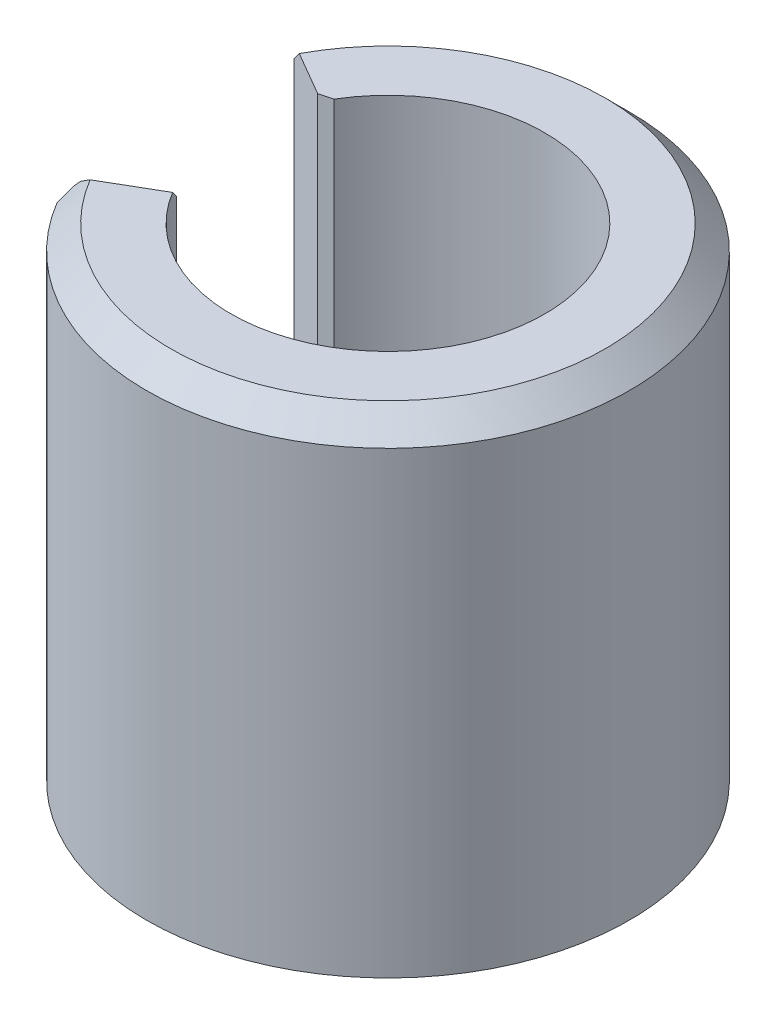
ISO-10303-21;
HEADER;
FILE_DESCRIPTION(('STEP AP214'),'2;1');
FILE_NAME('part.step','',(''),(''),'','','');
FILE_SCHEMA(('AUTOMOTIVE_DESIGN { 1 0 10303 214 1 1 1 1 }'));
ENDSEC;
DATA;
#1=APPLICATION_CONTEXT('core data for automotive mechanical design processes');
#2=APPLICATION_PROTOCOL_DEFINITION('international standard','automotive_design',2000,#1);
#3=PRODUCT_CONTEXT('',#1,'mechanical');
#4=PRODUCT('Part','Part','',(#3));
#5=PRODUCT_RELATED_PRODUCT_CATEGORY('part','',(#4));
#6=PRODUCT_DEFINITION_FORMATION('','',#4);
#7=PRODUCT_DEFINITION_CONTEXT('part definition',#1,'design');
#8=PRODUCT_DEFINITION('design','',#6,#7);
#9=PRODUCT_DEFINITION_SHAPE('','',#8);
#10=(LENGTH_UNIT() NAMED_UNIT(*) SI_UNIT(.MILLI.,.METRE.));
#11=(NAMED_UNIT(*) PLANE_ANGLE_UNIT() SI_UNIT($,.RADIAN.));
#12=(NAMED_UNIT(*) SI_UNIT($,.STERADIAN.) SOLID_ANGLE_UNIT());
#13=UNCERTAINTY_MEASURE_WITH_UNIT(LENGTH_MEASURE(1.E-05),#10,'distance_accuracy_value','');
#14=(GEOMETRIC_REPRESENTATION_CONTEXT(3) GLOBAL_UNCERTAINTY_ASSIGNED_CONTEXT((#13)) GLOBAL_UNIT_ASSIGNED_CONTEXT((#10,
#11,#12)) REPRESENTATION_CONTEXT('',''));
#15=CARTESIAN_POINT('',(0.,0.,0.));
#16=DIRECTION('',(0.,0.,1.));
#17=DIRECTION('',(1.,0.,0.));
#18=AXIS2_PLACEMENT_3D('',#15,#16,#17);
#19=CARTESIAN_POINT('',(0.,10.,0.));
#20=DIRECTION('',(0.,-1.,0.));
#21=DIRECTION('',(0.,0.,-1.));
#22=AXIS2_PLACEMENT_3D('',#19,#20,#21);
#23=CYLINDRICAL_SURFACE('',#22,3.25);
#24=DIRECTION('',(0.,-1.,0.));
#25=VECTOR('',#24,1.);
#26=CARTESIAN_POINT('',(-2.8831406486677,10.,1.5));
#27=LINE('',#26,#25);
#28=CARTESIAN_POINT('',(-2.8831406486677,9.8,1.5));
#29=VERTEX_POINT('',#28);
#30=CARTESIAN_POINT('',(-2.8831406486677,0.,1.5));
#31=VERTEX_POINT('',#30);
#32=EDGE_CURVE('E120',#29,#31,#27,.T.);
#33=ORIENTED_EDGE('',*,*,#32,.F.);
#34=CARTESIAN_POINT('',(0.,9.95138321985831,0.));
#35=DIRECTION('',(0.355221508707248,-0.707106781186546,0.611406313143517));
#36=DIRECTION('',(-0.355221508707247,-0.707106781186549,-0.611406313143515));
#37=AXIS2_PLACEMENT_3D('',#34,#35,#36);
#38=ELLIPSE('',#37,4.59619407771257,3.25);
#39=CARTESIAN_POINT('',(-2.78540456174295,10.,1.67452125320091));
#40=VERTEX_POINT('',#39);
#41=EDGE_CURVE('E157',#29,#40,#38,.F.);
#42=ORIENTED_EDGE('',*,*,#41,.T.);
#43=CARTESIAN_POINT('',(0.,10.,0.));
#44=DIRECTION('',(0.,1.,0.));
#45=DIRECTION('',(0.,0.,1.));
#46=AXIS2_PLACEMENT_3D('',#43,#44,#45);
#47=CIRCLE('',#46,3.25);
#48=CARTESIAN_POINT('',(-2.7870574838442,10.,-1.67176869863867));
#49=VERTEX_POINT('',#48);
#50=EDGE_CURVE('E152',#40,#49,#47,.T.);
#51=ORIENTED_EDGE('',*,*,#50,.T.);
#52=DIRECTION('',(0.,-1.,0.));
#53=VECTOR('',#52,1.);
#54=CARTESIAN_POINT('',(-2.7870574838442,10.,-1.67176869863867));
#55=LINE('',#54,#53);
#56=CARTESIAN_POINT('',(-2.7870574838442,0.,-1.67176869863867));
#57=VERTEX_POINT('',#56);
#58=EDGE_CURVE('E143',#49,#57,#55,.T.);
#59=ORIENTED_EDGE('',*,*,#58,.T.);
#60=CARTESIAN_POINT('',(0.,0.,0.));
#61=DIRECTION('',(0.,1.,0.));
#62=DIRECTION('',(0.,0.,1.));
#63=AXIS2_PLACEMENT_3D('',#60,#61,#62);
#64=CIRCLE('',#63,3.25);
#65=EDGE_CURVE('E135',#31,#57,#64,.T.);
#66=ORIENTED_EDGE('',*,*,#65,.F.);
#67=EDGE_LOOP('',(#33,#42,#51,#59,#66));
#68=FACE_BOUND('',#67,.T.);
#69=ADVANCED_FACE('F43',(#68),#23,.F.);
#70=CARTESIAN_POINT('',(-0.076048734337961,10.,-0.130894878663227));
#71=DIRECTION('',(-0.502359075260422,0.,-0.864659100168091));
#72=DIRECTION('',(-0.864659100168091,0.,0.502359075260422));
#73=AXIS2_PLACEMENT_3D('',#70,#71,#72);
#74=PLANE('',#73);
#75=DIRECTION('',(0.,1.,0.));
#76=VECTOR('',#75,1.);
#77=CARTESIAN_POINT('',(-4.22443043201248,10.,2.27927716840816));
#78=LINE('',#77,#76);
#79=CARTESIAN_POINT('',(-4.22443043201248,0.,2.27927716840816));
#80=VERTEX_POINT('',#79);
#81=CARTESIAN_POINT('',(-4.22443043201248,9.69990449206061,2.27927716840816));
#82=VERTEX_POINT('',#81);
#83=EDGE_CURVE('E128',#80,#82,#78,.T.);
#84=ORIENTED_EDGE('',*,*,#83,.T.);
#85=CARTESIAN_POINT('',(-4.22443043201248,9.69990449206061,2.27927716840816));
#86=CARTESIAN_POINT('',(-4.20999842873636,9.71658716612793,2.27089230572813));
#87=CARTESIAN_POINT('',(-4.19556638682498,9.73326979548987,2.26250742060136));
#88=CARTESIAN_POINT('',(-4.16670222573165,9.76663496480301,2.24573760545434));
#89=CARTESIAN_POINT('',(-4.15227010654972,9.78331750475419,2.23735267543409));
#90=CARTESIAN_POINT('',(-4.13783794873251,9.8,2.22896772296709));
#91=B_SPLINE_CURVE_WITH_KNOTS('',3,(#85,#86,#87,#88,#89,#90),.UNSPECIFIED.,.F.,.F.,(4,2,4),(0.,
0.0707962025305121,0.141592405061035),.UNSPECIFIED.);
#92=CARTESIAN_POINT('',(-4.13783794873251,9.8,2.22896772296709));
#93=VERTEX_POINT('',#92);
#94=EDGE_CURVE('E58',#82,#93,#91,.T.);
#95=ORIENTED_EDGE('',*,*,#94,.T.);
#96=DIRECTION('',(0.864659100168091,0.,-0.502359075260422));
#97=VECTOR('',#96,1.);
#98=CARTESIAN_POINT('',(-0.076048734337961,9.8,-0.130894878663227));
#99=LINE('',#98,#97);
#100=EDGE_CURVE('E124',#93,#29,#99,.T.);
#101=ORIENTED_EDGE('',*,*,#100,.T.);
#102=ORIENTED_EDGE('',*,*,#32,.T.);
#103=DIRECTION('',(0.864659100168091,0.,-0.502359075260422));
#104=VECTOR('',#103,1.);
#105=CARTESIAN_POINT('',(-0.076048734337961,0.,-0.130894878663227));
#106=LINE('',#105,#104);
#107=EDGE_CURVE('E123',#80,#31,#106,.T.);
#108=ORIENTED_EDGE('',*,*,#107,.F.);
#109=EDGE_LOOP('',(#84,#95,#101,#102,#108));
#110=FACE_BOUND('',#109,.T.);
#111=ADVANCED_FACE('F122',(#110),#74,.T.);
#112=CARTESIAN_POINT('',(0.,10.,0.));
#113=DIRECTION('',(0.,-1.,0.));
#114=DIRECTION('',(0.,0.,-1.));
#115=AXIS2_PLACEMENT_3D('',#112,#113,#114);
#116=CYLINDRICAL_SURFACE('',#115,5.);
#117=DIRECTION('',(0.,-1.,0.));
#118=VECTOR('',#117,1.);
#119=CARTESIAN_POINT('',(-4.30061913286326,10.,-2.55042644944927));
#120=LINE('',#119,#118);
#121=CARTESIAN_POINT('',(-4.30061913286326,0.,-2.55042644944927));
#122=VERTEX_POINT('',#121);
#123=CARTESIAN_POINT('',(-4.30061913286326,9.5,-2.55042644944927));
#124=VERTEX_POINT('',#123);
#125=EDGE_CURVE('E164',#122,#124,#120,.F.);
#126=ORIENTED_EDGE('',*,*,#125,.T.);
#127=CARTESIAN_POINT('',(0.,9.5,0.));
#128=DIRECTION('',(0.,1.,0.));
#129=DIRECTION('',(0.,0.,1.));
#130=AXIS2_PLACEMENT_3D('',#127,#128,#129);
#131=CIRCLE('',#130,5.);
#132=CARTESIAN_POINT('',(-4.29762794941674,9.5,2.55546356037257));
#133=VERTEX_POINT('',#132);
#134=EDGE_CURVE('E221',#124,#133,#131,.F.);
#135=ORIENTED_EDGE('',*,*,#134,.T.);
#136=DIRECTION('',(0.,-1.,0.));
#137=VECTOR('',#136,1.);
#138=CARTESIAN_POINT('',(-4.29762794941674,10.,2.55546356037257));
#139=LINE('',#138,#137);
#140=CARTESIAN_POINT('',(-4.29762794941674,0.,2.55546356037257));
#141=VERTEX_POINT('',#140);
#142=EDGE_CURVE('E167',#133,#141,#139,.T.);
#143=ORIENTED_EDGE('',*,*,#142,.T.);
#144=CARTESIAN_POINT('',(0.,0.,0.));
#145=DIRECTION('',(0.,1.,0.));
#146=DIRECTION('',(0.,0.,1.));
#147=AXIS2_PLACEMENT_3D('',#144,#145,#146);
#148=CIRCLE('',#147,5.);
#149=EDGE_CURVE('E138',#141,#122,#148,.T.);
#150=ORIENTED_EDGE('',*,*,#149,.T.);
#151=EDGE_LOOP('',(#126,#135,#143,#150));
#152=FACE_BOUND('',#151,.T.);
#153=ADVANCED_FACE('F202',(#152),#116,.T.);
#154=CARTESIAN_POINT('',(-0.0760487343379624,10.,0.130894878663229));
#155=DIRECTION('',(0.502359075260422,0.,-0.864659100168091));
#156=DIRECTION('',(-0.864659100168091,0.,-0.502359075260422));
#157=AXIS2_PLACEMENT_3D('',#154,#155,#156);
#158=PLANE('',#157);
#159=DIRECTION('',(0.864659100168091,0.,0.502359075260422));
#160=VECTOR('',#159,1.);
#161=CARTESIAN_POINT('',(-0.0760487343379624,10.,0.130894878663229));
#162=LINE('',#161,#160);
#163=CARTESIAN_POINT('',(-3.96481236313895,10.,-2.12844143097725));
#164=VERTEX_POINT('',#163);
#165=CARTESIAN_POINT('',(-3.05607246870132,10.,-1.60047181505208));
#166=VERTEX_POINT('',#165);
#167=EDGE_CURVE('E129',#164,#166,#162,.T.);
#168=ORIENTED_EDGE('',*,*,#167,.F.);
#169=CARTESIAN_POINT('',(-3.96481236313896,10.,-2.12844143097725));
#170=CARTESIAN_POINT('',(-4.00716881715182,9.95104136839675,-2.15305014563147));
#171=CARTESIAN_POINT('',(-4.04952491541295,9.90208232513896,-2.17765865359717));
#172=CARTESIAN_POINT('',(-4.13423640043159,9.80416341531452,-2.22687525615144));
#173=CARTESIAN_POINT('',(-4.17659178718909,9.75520354874788,-2.25148335074));
#174=CARTESIAN_POINT('',(-4.21894681819487,9.7062432705267,-2.27609123864004));
#175=B_SPLINE_CURVE_WITH_KNOTS('',3,(#169,#170,#171,#172,#173,#174),.UNSPECIFIED.,.F.,.F.,(4,2,
4),(0.,0.207772593881652,0.415545187762375),.UNSPECIFIED.);
#176=CARTESIAN_POINT('',(-4.21894681819487,9.7062432705267,-2.27609123864004));
#177=VERTEX_POINT('',#176);
#178=EDGE_CURVE('E182',#164,#177,#175,.T.);
#179=ORIENTED_EDGE('',*,*,#178,.T.);
#180=DIRECTION('',(0.,-1.,0.));
#181=VECTOR('',#180,1.);
#182=CARTESIAN_POINT('',(-4.21894681819487,10.,-2.27609123864004));
#183=LINE('',#182,#181);
#184=CARTESIAN_POINT('',(-4.21894681819487,0.,-2.27609123864004));
#185=VERTEX_POINT('',#184);
#186=EDGE_CURVE('E177',#177,#185,#183,.T.);
#187=ORIENTED_EDGE('',*,*,#186,.T.);
#188=DIRECTION('',(0.864659100168091,0.,0.502359075260422));
#189=VECTOR('',#188,1.);
#190=CARTESIAN_POINT('',(-0.0760487343379624,0.,0.130894878663229));
#191=LINE('',#190,#189);
#192=CARTESIAN_POINT('',(-3.05607246870132,0.,-1.60047181505208));
#193=VERTEX_POINT('',#192);
#194=EDGE_CURVE('E150',#185,#193,#191,.T.);
#195=ORIENTED_EDGE('',*,*,#194,.T.);
#196=DIRECTION('',(0.,1.,0.));
#197=VECTOR('',#196,1.);
#198=CARTESIAN_POINT('',(-3.05607246870132,10.,-1.60047181505208));
#199=LINE('',#198,#197);
#200=EDGE_CURVE('E174',#193,#166,#199,.T.);
#201=ORIENTED_EDGE('',*,*,#200,.T.);
#202=EDGE_LOOP('',(#168,#179,#187,#195,#201));
#203=FACE_BOUND('',#202,.T.);
#204=ADVANCED_FACE('F196',(#203),#158,.F.);
#205=CARTESIAN_POINT('',(0.,10.,0.));
#206=DIRECTION('',(0.,1.,0.));
#207=DIRECTION('',(0.,0.,1.));
#208=AXIS2_PLACEMENT_3D('',#205,#206,#207);
#209=PLANE('',#208);
#210=DIRECTION('',(-0.864659100168091,0.,0.502359075260422));
#211=VECTOR('',#210,1.);
#212=CARTESIAN_POINT('',(0.0244230807141206,10.,0.042036941370387));
#213=LINE('',#212,#211);
#214=CARTESIAN_POINT('',(-3.86631578555614,10.,2.3025208460206));
#215=VERTEX_POINT('',#214);
#216=EDGE_CURVE('E161',#40,#215,#213,.T.);
#217=ORIENTED_EDGE('',*,*,#216,.T.);
#218=CARTESIAN_POINT('',(0.,10.,0.));
#219=DIRECTION('',(0.,1.,0.));
#220=DIRECTION('',(0.,0.,1.));
#221=AXIS2_PLACEMENT_3D('',#218,#219,#220);
#222=CIRCLE('',#221,4.5);
#223=EDGE_CURVE('E179',#215,#164,#222,.T.);
#224=ORIENTED_EDGE('',*,*,#223,.T.);
#225=ORIENTED_EDGE('',*,*,#167,.T.);
#226=DIRECTION('',(-0.966627821850763,0.,0.256184804436268));
#227=VECTOR('',#226,1.);
#228=CARTESIAN_POINT('',(-0.59690544816139,10.,-2.25222340753874));
#229=LINE('',#228,#227);
#230=EDGE_CURVE('E159',#166,#49,#229,.F.);
#231=ORIENTED_EDGE('',*,*,#230,.T.);
#232=ORIENTED_EDGE('',*,*,#50,.F.);
#233=EDGE_LOOP('',(#217,#224,#225,#231,#232));
#234=FACE_BOUND('',#233,.T.);
#235=ADVANCED_FACE('F201',(#234),#209,.T.);
#236=CARTESIAN_POINT('',(0.,0.,0.));
#237=DIRECTION('',(0.,1.,0.));
#238=DIRECTION('',(0.,0.,1.));
#239=AXIS2_PLACEMENT_3D('',#236,#237,#238);
#240=PLANE('',#239);
#241=ORIENTED_EDGE('',*,*,#149,.F.);
#242=DIRECTION('',(-0.256184804436272,0.,0.966627821850762));
#243=VECTOR('',#242,1.);
#244=CARTESIAN_POINT('',(-4.29762794941674,0.,2.55546356037257));
#245=LINE('',#244,#243);
#246=EDGE_CURVE('E137',#141,#80,#245,.F.);
#247=ORIENTED_EDGE('',*,*,#246,.T.);
#248=ORIENTED_EDGE('',*,*,#107,.T.);
#249=ORIENTED_EDGE('',*,*,#65,.T.);
#250=DIRECTION('',(0.966627821850763,0.,-0.256184804436268));
#251=VECTOR('',#250,1.);
#252=CARTESIAN_POINT('',(-2.7870574838442,0.,-1.67176869863867));
#253=LINE('',#252,#251);
#254=EDGE_CURVE('E169',#57,#193,#253,.F.);
#255=ORIENTED_EDGE('',*,*,#254,.T.);
#256=ORIENTED_EDGE('',*,*,#194,.F.);
#257=DIRECTION('',(0.2853336048058,0.,0.958428262296416));
#258=VECTOR('',#257,1.);
#259=CARTESIAN_POINT('',(-4.21894681819487,0.,-2.27609123864004));
#260=LINE('',#259,#258);
#261=EDGE_CURVE('E171',#185,#122,#260,.F.);
#262=ORIENTED_EDGE('',*,*,#261,.T.);
#263=EDGE_LOOP('',(#241,#247,#248,#249,#255,#256,#262));
#264=FACE_BOUND('',#263,.T.);
#265=ADVANCED_FACE('F134',(#264),#240,.F.);
#266=CARTESIAN_POINT('',(-4.29762794941674,10.,2.55546356037257));
#267=DIRECTION('',(0.966627821850762,0.,0.256184804436272));
#268=DIRECTION('',(0.,-1.,0.));
#269=AXIS2_PLACEMENT_3D('',#266,#267,#268);
#270=PLANE('',#269);
#271=ORIENTED_EDGE('',*,*,#142,.F.);
#272=CARTESIAN_POINT('',(-4.29762794941674,9.5,2.55546356037257));
#273=CARTESIAN_POINT('',(-4.28551365876637,9.53379323950022,2.50975432945076));
#274=CARTESIAN_POINT('',(-4.2733567234524,9.56734855855921,2.46388419312954));
#275=CARTESIAN_POINT('',(-4.24895755107119,9.63398338973076,2.37182206280252));
#276=CARTESIAN_POINT('',(-4.23671531391707,9.66706290135864,2.32563006846894));
#277=CARTESIAN_POINT('',(-4.22443043201248,9.69990449206061,2.27927716840816));
#278=B_SPLINE_CURVE_WITH_KNOTS('',3,(#272,#273,#274,#275,#276,#277),.UNSPECIFIED.,.F.,.F.,(4,2,
4),(0.,0.174357045385461,0.348714268365536),.UNSPECIFIED.);
#279=EDGE_CURVE('E72',#133,#82,#278,.T.);
#280=ORIENTED_EDGE('',*,*,#279,.T.);
#281=ORIENTED_EDGE('',*,*,#83,.F.);
#282=ORIENTED_EDGE('',*,*,#246,.F.);
#283=EDGE_LOOP('',(#271,#280,#281,#282));
#284=FACE_BOUND('',#283,.T.);
#285=ADVANCED_FACE('F223',(#284),#270,.F.);
#286=CARTESIAN_POINT('',(-0.076048734337961,9.8,-0.130894878663227));
#287=DIRECTION('',(0.355221508707248,-0.707106781186546,0.611406313143517));
#288=DIRECTION('',(0.864659100168091,0.,-0.502359075260422));
#289=AXIS2_PLACEMENT_3D('',#286,#287,#288);
#290=PLANE('',#289);
#291=ORIENTED_EDGE('',*,*,#100,.F.);
#292=CARTESIAN_POINT('',(-4.13783794873251,9.8,2.22896772296709));
#293=CARTESIAN_POINT('',(-4.09287771169015,9.8335688174432,2.24166941585041));
#294=CARTESIAN_POINT('',(-4.04777075886973,9.86701988365204,2.25414968593612));
#295=CARTESIAN_POINT('',(-3.9572633714698,9.93368655057997,2.2786673941119));
#296=CARTESIAN_POINT('',(-3.91186293656476,9.96690215103779,2.2907048317107));
#297=CARTESIAN_POINT('',(-3.86631578555614,10.,2.3025208460206));
#298=B_SPLINE_CURVE_WITH_KNOTS('',3,(#292,#293,#294,#295,#296,#297),.UNSPECIFIED.,.F.,.F.,(4,2,
4),(0.,0.172581324256064,0.3451628399684),.UNSPECIFIED.);
#299=EDGE_CURVE('E11',#93,#215,#298,.T.);
#300=ORIENTED_EDGE('',*,*,#299,.T.);
#301=ORIENTED_EDGE('',*,*,#216,.F.);
#302=ORIENTED_EDGE('',*,*,#41,.F.);
#303=EDGE_LOOP('',(#291,#300,#301,#302));
#304=FACE_BOUND('',#303,.T.);
#305=ADVANCED_FACE('F229',(#304),#290,.F.);
#306=CARTESIAN_POINT('',(-4.21894681819487,10.,-2.27609123864004));
#307=DIRECTION('',(0.958428262296416,0.,-0.2853336048058));
#308=DIRECTION('',(0.,-1.,0.));
#309=AXIS2_PLACEMENT_3D('',#306,#307,#308);
#310=PLANE('',#309);
#311=ORIENTED_EDGE('',*,*,#186,.F.);
#312=CARTESIAN_POINT('',(-4.21894681819487,9.7062432705267,-2.27609123864004));
#313=CARTESIAN_POINT('',(-4.23264960450932,9.67231067192011,-2.32211854651679));
#314=CARTESIAN_POINT('',(-4.24630702693512,9.63815742556277,-2.36799347825475));
#315=CARTESIAN_POINT('',(-4.27353113174283,9.56940966832286,-2.45943854824986));
#316=CARTESIAN_POINT('',(-4.28709781420649,9.53481515783797,-2.50500868678165));
#317=CARTESIAN_POINT('',(-4.30061913286326,9.5,-2.55042644944927));
#318=B_SPLINE_CURVE_WITH_KNOTS('',3,(#312,#313,#314,#315,#316,#317),.UNSPECIFIED.,.F.,.F.,(4,2,
4),(0.,0.176400989436609,0.352801819908277),.UNSPECIFIED.);
#319=EDGE_CURVE('E189',#177,#124,#318,.T.);
#320=ORIENTED_EDGE('',*,*,#319,.T.);
#321=ORIENTED_EDGE('',*,*,#125,.F.);
#322=ORIENTED_EDGE('',*,*,#261,.F.);
#323=EDGE_LOOP('',(#311,#320,#321,#322));
#324=FACE_BOUND('',#323,.T.);
#325=ADVANCED_FACE('F232',(#324),#310,.F.);
#326=CARTESIAN_POINT('',(-2.7870574838442,10.,-1.67176869863867));
#327=DIRECTION('',(-0.256184804436268,0.,-0.966627821850763));
#328=DIRECTION('',(0.,-1.,0.));
#329=AXIS2_PLACEMENT_3D('',#326,#327,#328);
#330=PLANE('',#329);
#331=ORIENTED_EDGE('',*,*,#230,.F.);
#332=ORIENTED_EDGE('',*,*,#200,.F.);
#333=ORIENTED_EDGE('',*,*,#254,.F.);
#334=ORIENTED_EDGE('',*,*,#58,.F.);
#335=EDGE_LOOP('',(#331,#332,#333,#334));
#336=FACE_BOUND('',#335,.T.);
#337=ADVANCED_FACE('F238',(#336),#330,.F.);
#338=CARTESIAN_POINT('',(0.,10.,0.));
#339=DIRECTION('',(0.,-1.,0.));
#340=DIRECTION('',(0.,0.,-1.));
#341=AXIS2_PLACEMENT_3D('',#338,#339,#340);
#342=CONICAL_SURFACE('',#341,4.5,0.785398163397448);
#343=ORIENTED_EDGE('',*,*,#279,.F.);
#344=ORIENTED_EDGE('',*,*,#134,.F.);
#345=ORIENTED_EDGE('',*,*,#319,.F.);
#346=ORIENTED_EDGE('',*,*,#178,.F.);
#347=ORIENTED_EDGE('',*,*,#223,.F.);
#348=ORIENTED_EDGE('',*,*,#299,.F.);
#349=ORIENTED_EDGE('',*,*,#94,.F.);
#350=EDGE_LOOP('',(#343,#344,#345,#346,#347,#348,#349));
#351=FACE_BOUND('',#350,.T.);
#352=ADVANCED_FACE('F46',(#351),#342,.T.);
#353=CLOSED_SHELL('',(#69,#111,#153,#204,#235,#265,#285,#305,#325,#337,#352));
#354=MANIFOLD_SOLID_BREP('B2',#353);
#355=ADVANCED_BREP_SHAPE_REPRESENTATION('',(#18,#354),#14);
#356=SHAPE_DEFINITION_REPRESENTATION(#9,#355);
ENDSEC;
END-ISO-10303-21;
